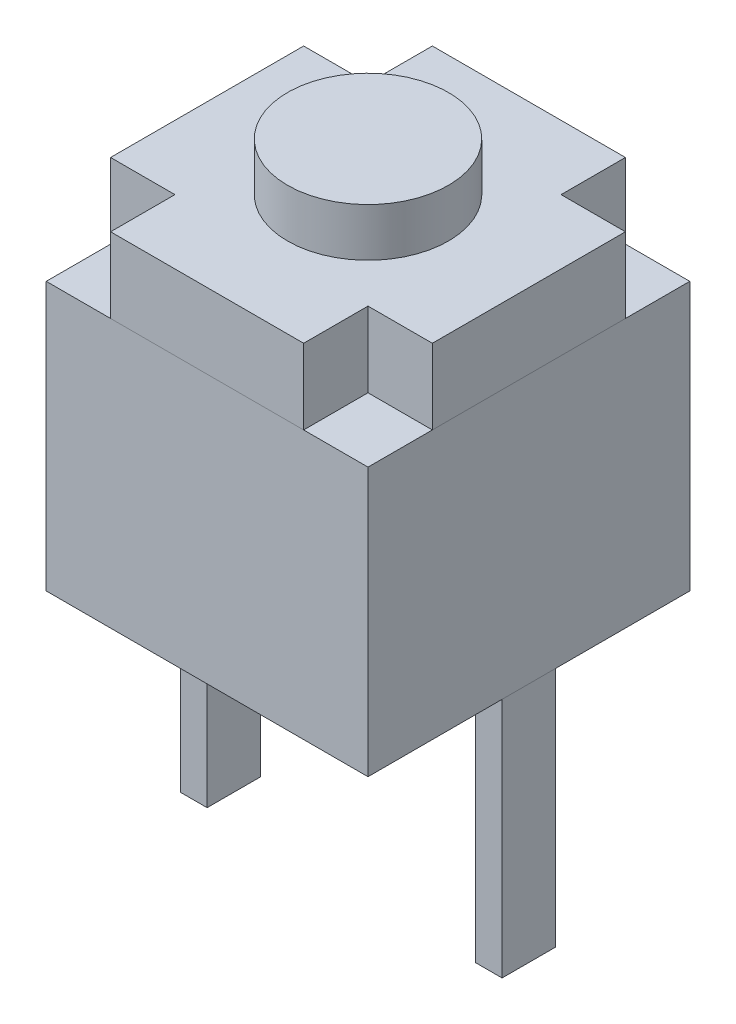
ISO-10303-21;
HEADER;
FILE_DESCRIPTION(('STEP AP214'),'2;1');
FILE_NAME('part.step','',(''),(''),'','','');
FILE_SCHEMA(('AUTOMOTIVE_DESIGN { 1 0 10303 214 1 1 1 1 }'));
ENDSEC;
DATA;
#1=APPLICATION_CONTEXT('core data for automotive mechanical design processes');
#2=APPLICATION_PROTOCOL_DEFINITION('international standard','automotive_design',2000,#1);
#3=PRODUCT_CONTEXT('',#1,'mechanical');
#4=PRODUCT('Part','Part','',(#3));
#5=PRODUCT_RELATED_PRODUCT_CATEGORY('part','',(#4));
#6=PRODUCT_DEFINITION_FORMATION('','',#4);
#7=PRODUCT_DEFINITION_CONTEXT('part definition',#1,'design');
#8=PRODUCT_DEFINITION('design','',#6,#7);
#9=PRODUCT_DEFINITION_SHAPE('','',#8);
#10=(LENGTH_UNIT() NAMED_UNIT(*) SI_UNIT(.MILLI.,.METRE.));
#11=(NAMED_UNIT(*) PLANE_ANGLE_UNIT() SI_UNIT($,.RADIAN.));
#12=(NAMED_UNIT(*) SI_UNIT($,.STERADIAN.) SOLID_ANGLE_UNIT());
#13=UNCERTAINTY_MEASURE_WITH_UNIT(LENGTH_MEASURE(1.E-05),#10,'distance_accuracy_value','');
#14=(GEOMETRIC_REPRESENTATION_CONTEXT(3) GLOBAL_UNCERTAINTY_ASSIGNED_CONTEXT((#13)) GLOBAL_UNIT_ASSIGNED_CONTEXT((#10,
#11,#12)) REPRESENTATION_CONTEXT('',''));
#15=CARTESIAN_POINT('',(0.,0.,0.));
#16=DIRECTION('',(0.,0.,1.));
#17=DIRECTION('',(1.,0.,0.));
#18=AXIS2_PLACEMENT_3D('',#15,#16,#17);
#19=CARTESIAN_POINT('',(-2.5,-4.5,-0.5));
#20=DIRECTION('',(0.,0.,1.));
#21=DIRECTION('',(1.,0.,0.));
#22=AXIS2_PLACEMENT_3D('',#19,#20,#21);
#23=PLANE('',#22);
#24=DIRECTION('',(1.,0.,0.));
#25=VECTOR('',#24,1.);
#26=CARTESIAN_POINT('',(-2.5,0.,-0.5));
#27=LINE('',#26,#25);
#28=CARTESIAN_POINT('',(-3.,0.,-0.5));
#29=VERTEX_POINT('',#28);
#30=CARTESIAN_POINT('',(-2.5,0.,-0.5));
#31=VERTEX_POINT('',#30);
#32=EDGE_CURVE('E109',#29,#31,#27,.T.);
#33=ORIENTED_EDGE('',*,*,#32,.T.);
#34=DIRECTION('',(0.,1.,0.));
#35=VECTOR('',#34,1.);
#36=CARTESIAN_POINT('',(-2.5,-4.5,-0.5));
#37=LINE('',#36,#35);
#38=CARTESIAN_POINT('',(-2.5,-4.5,-0.5));
#39=VERTEX_POINT('',#38);
#40=EDGE_CURVE('E12',#39,#31,#37,.T.);
#41=ORIENTED_EDGE('',*,*,#40,.F.);
#42=DIRECTION('',(1.,0.,0.));
#43=VECTOR('',#42,1.);
#44=CARTESIAN_POINT('',(-2.5,-4.5,-0.5));
#45=LINE('',#44,#43);
#46=CARTESIAN_POINT('',(-3.,-4.5,-0.5));
#47=VERTEX_POINT('',#46);
#48=EDGE_CURVE('E97',#47,#39,#45,.T.);
#49=ORIENTED_EDGE('',*,*,#48,.F.);
#50=DIRECTION('',(0.,1.,0.));
#51=VECTOR('',#50,1.);
#52=CARTESIAN_POINT('',(-3.,-4.5,-0.5));
#53=LINE('',#52,#51);
#54=EDGE_CURVE('E105',#47,#29,#53,.T.);
#55=ORIENTED_EDGE('',*,*,#54,.T.);
#56=EDGE_LOOP('',(#33,#41,#49,#55));
#57=FACE_BOUND('',#56,.T.);
#58=ADVANCED_FACE('F46',(#57),#23,.F.);
#59=CARTESIAN_POINT('',(-2.5,-4.5,-0.5));
#60=DIRECTION('',(-1.,0.,0.));
#61=DIRECTION('',(0.,0.,1.));
#62=AXIS2_PLACEMENT_3D('',#59,#60,#61);
#63=PLANE('',#62);
#64=DIRECTION('',(0.,0.,1.));
#65=VECTOR('',#64,1.);
#66=CARTESIAN_POINT('',(-2.5,0.,-0.5));
#67=LINE('',#66,#65);
#68=CARTESIAN_POINT('',(-2.5,0.,0.5));
#69=VERTEX_POINT('',#68);
#70=EDGE_CURVE('E101',#31,#69,#67,.T.);
#71=ORIENTED_EDGE('',*,*,#70,.T.);
#72=DIRECTION('',(0.,1.,0.));
#73=VECTOR('',#72,1.);
#74=CARTESIAN_POINT('',(-2.5,-4.5,0.5));
#75=LINE('',#74,#73);
#76=CARTESIAN_POINT('',(-2.5,-4.5,0.5));
#77=VERTEX_POINT('',#76);
#78=EDGE_CURVE('E54',#77,#69,#75,.T.);
#79=ORIENTED_EDGE('',*,*,#78,.F.);
#80=DIRECTION('',(0.,0.,1.));
#81=VECTOR('',#80,1.);
#82=CARTESIAN_POINT('',(-2.5,-4.5,-0.5));
#83=LINE('',#82,#81);
#84=EDGE_CURVE('E92',#39,#77,#83,.T.);
#85=ORIENTED_EDGE('',*,*,#84,.F.);
#86=ORIENTED_EDGE('',*,*,#40,.T.);
#87=EDGE_LOOP('',(#71,#79,#85,#86));
#88=FACE_BOUND('',#87,.T.);
#89=ADVANCED_FACE('F100',(#88),#63,.F.);
#90=CARTESIAN_POINT('',(-2.5,-4.5,0.5));
#91=DIRECTION('',(0.,0.,-1.));
#92=DIRECTION('',(-1.,0.,0.));
#93=AXIS2_PLACEMENT_3D('',#90,#91,#92);
#94=PLANE('',#93);
#95=DIRECTION('',(-1.,0.,0.));
#96=VECTOR('',#95,1.);
#97=CARTESIAN_POINT('',(-2.5,0.,0.5));
#98=LINE('',#97,#96);
#99=CARTESIAN_POINT('',(-3.,0.,0.5));
#100=VERTEX_POINT('',#99);
#101=EDGE_CURVE('E79',#69,#100,#98,.T.);
#102=ORIENTED_EDGE('',*,*,#101,.T.);
#103=DIRECTION('',(0.,1.,0.));
#104=VECTOR('',#103,1.);
#105=CARTESIAN_POINT('',(-3.,-4.5,0.5));
#106=LINE('',#105,#104);
#107=CARTESIAN_POINT('',(-3.,-4.5,0.5));
#108=VERTEX_POINT('',#107);
#109=EDGE_CURVE('E102',#108,#100,#106,.T.);
#110=ORIENTED_EDGE('',*,*,#109,.F.);
#111=DIRECTION('',(-1.,0.,0.));
#112=VECTOR('',#111,1.);
#113=CARTESIAN_POINT('',(-2.5,-4.5,0.5));
#114=LINE('',#113,#112);
#115=EDGE_CURVE('E95',#77,#108,#114,.T.);
#116=ORIENTED_EDGE('',*,*,#115,.F.);
#117=ORIENTED_EDGE('',*,*,#78,.T.);
#118=EDGE_LOOP('',(#102,#110,#116,#117));
#119=FACE_BOUND('',#118,.T.);
#120=ADVANCED_FACE('F103',(#119),#94,.F.);
#121=CARTESIAN_POINT('',(-3.,-4.5,-0.5));
#122=DIRECTION('',(1.,0.,0.));
#123=DIRECTION('',(0.,0.,-1.));
#124=AXIS2_PLACEMENT_3D('',#121,#122,#123);
#125=PLANE('',#124);
#126=DIRECTION('',(0.,0.,-1.));
#127=VECTOR('',#126,1.);
#128=CARTESIAN_POINT('',(-3.,0.,-0.5));
#129=LINE('',#128,#127);
#130=EDGE_CURVE('E85',#100,#29,#129,.T.);
#131=ORIENTED_EDGE('',*,*,#130,.T.);
#132=ORIENTED_EDGE('',*,*,#54,.F.);
#133=DIRECTION('',(0.,0.,-1.));
#134=VECTOR('',#133,1.);
#135=CARTESIAN_POINT('',(-3.,-4.5,-0.5));
#136=LINE('',#135,#134);
#137=EDGE_CURVE('E62',#108,#47,#136,.T.);
#138=ORIENTED_EDGE('',*,*,#137,.F.);
#139=ORIENTED_EDGE('',*,*,#109,.T.);
#140=EDGE_LOOP('',(#131,#132,#138,#139));
#141=FACE_BOUND('',#140,.T.);
#142=ADVANCED_FACE('F116',(#141),#125,.F.);
#143=CARTESIAN_POINT('',(0.,-4.5,0.));
#144=DIRECTION('',(0.,1.,0.));
#145=DIRECTION('',(0.,0.,1.));
#146=AXIS2_PLACEMENT_3D('',#143,#144,#145);
#147=PLANE('',#146);
#148=ORIENTED_EDGE('',*,*,#48,.T.);
#149=ORIENTED_EDGE('',*,*,#84,.T.);
#150=ORIENTED_EDGE('',*,*,#115,.T.);
#151=ORIENTED_EDGE('',*,*,#137,.T.);
#152=EDGE_LOOP('',(#148,#149,#150,#151));
#153=FACE_BOUND('',#152,.T.);
#154=ADVANCED_FACE('F93',(#153),#147,.F.);
#155=CARTESIAN_POINT('',(0.,0.,0.));
#156=DIRECTION('',(0.,1.,0.));
#157=DIRECTION('',(0.,0.,1.));
#158=AXIS2_PLACEMENT_3D('',#155,#156,#157);
#159=PLANE('',#158);
#160=ORIENTED_EDGE('',*,*,#32,.F.);
#161=ORIENTED_EDGE('',*,*,#130,.F.);
#162=ORIENTED_EDGE('',*,*,#101,.F.);
#163=ORIENTED_EDGE('',*,*,#70,.F.);
#164=EDGE_LOOP('',(#160,#161,#162,#163));
#165=FACE_BOUND('',#164,.T.);
#166=ADVANCED_FACE('F119',(#165),#159,.T.);
#167=CLOSED_SHELL('',(#58,#89,#120,#142,#154,#166));
#168=MANIFOLD_SOLID_BREP('B2',#167);
#169=CARTESIAN_POINT('',(3.,-4.5,-0.5));
#170=DIRECTION('',(-1.,0.,0.));
#171=DIRECTION('',(0.,0.,1.));
#172=AXIS2_PLACEMENT_3D('',#169,#170,#171);
#173=PLANE('',#172);
#174=DIRECTION('',(0.,0.,1.));
#175=VECTOR('',#174,1.);
#176=CARTESIAN_POINT('',(3.,0.,-0.5));
#177=LINE('',#176,#175);
#178=CARTESIAN_POINT('',(3.,0.,-0.5));
#179=VERTEX_POINT('',#178);
#180=CARTESIAN_POINT('',(3.,0.,0.5));
#181=VERTEX_POINT('',#180);
#182=EDGE_CURVE('E241',#179,#181,#177,.T.);
#183=ORIENTED_EDGE('',*,*,#182,.T.);
#184=DIRECTION('',(0.,1.,0.));
#185=VECTOR('',#184,1.);
#186=CARTESIAN_POINT('',(3.,-4.5,0.5));
#187=LINE('',#186,#185);
#188=CARTESIAN_POINT('',(3.,-4.5,0.5));
#189=VERTEX_POINT('',#188);
#190=EDGE_CURVE('E44',#189,#181,#187,.T.);
#191=ORIENTED_EDGE('',*,*,#190,.F.);
#192=DIRECTION('',(0.,0.,1.));
#193=VECTOR('',#192,1.);
#194=CARTESIAN_POINT('',(3.,-4.5,-0.5));
#195=LINE('',#194,#193);
#196=CARTESIAN_POINT('',(3.,-4.5,-0.5));
#197=VERTEX_POINT('',#196);
#198=EDGE_CURVE('E229',#197,#189,#195,.T.);
#199=ORIENTED_EDGE('',*,*,#198,.F.);
#200=DIRECTION('',(0.,1.,0.));
#201=VECTOR('',#200,1.);
#202=CARTESIAN_POINT('',(3.,-4.5,-0.5));
#203=LINE('',#202,#201);
#204=EDGE_CURVE('E237',#197,#179,#203,.T.);
#205=ORIENTED_EDGE('',*,*,#204,.T.);
#206=EDGE_LOOP('',(#183,#191,#199,#205));
#207=FACE_BOUND('',#206,.T.);
#208=ADVANCED_FACE('F178',(#207),#173,.F.);
#209=CARTESIAN_POINT('',(2.5,-4.5,0.5));
#210=DIRECTION('',(0.,0.,-1.));
#211=DIRECTION('',(-1.,0.,0.));
#212=AXIS2_PLACEMENT_3D('',#209,#210,#211);
#213=PLANE('',#212);
#214=DIRECTION('',(-1.,0.,0.));
#215=VECTOR('',#214,1.);
#216=CARTESIAN_POINT('',(2.5,0.,0.5));
#217=LINE('',#216,#215);
#218=CARTESIAN_POINT('',(2.5,0.,0.5));
#219=VERTEX_POINT('',#218);
#220=EDGE_CURVE('E233',#181,#219,#217,.T.);
#221=ORIENTED_EDGE('',*,*,#220,.T.);
#222=DIRECTION('',(0.,1.,0.));
#223=VECTOR('',#222,1.);
#224=CARTESIAN_POINT('',(2.5,-4.5,0.5));
#225=LINE('',#224,#223);
#226=CARTESIAN_POINT('',(2.5,-4.5,0.5));
#227=VERTEX_POINT('',#226);
#228=EDGE_CURVE('E186',#227,#219,#225,.T.);
#229=ORIENTED_EDGE('',*,*,#228,.F.);
#230=DIRECTION('',(-1.,0.,0.));
#231=VECTOR('',#230,1.);
#232=CARTESIAN_POINT('',(2.5,-4.5,0.5));
#233=LINE('',#232,#231);
#234=EDGE_CURVE('E224',#189,#227,#233,.T.);
#235=ORIENTED_EDGE('',*,*,#234,.F.);
#236=ORIENTED_EDGE('',*,*,#190,.T.);
#237=EDGE_LOOP('',(#221,#229,#235,#236));
#238=FACE_BOUND('',#237,.T.);
#239=ADVANCED_FACE('F232',(#238),#213,.F.);
#240=CARTESIAN_POINT('',(2.5,-4.5,-0.5));
#241=DIRECTION('',(1.,0.,0.));
#242=DIRECTION('',(0.,0.,-1.));
#243=AXIS2_PLACEMENT_3D('',#240,#241,#242);
#244=PLANE('',#243);
#245=DIRECTION('',(0.,0.,-1.));
#246=VECTOR('',#245,1.);
#247=CARTESIAN_POINT('',(2.5,0.,-0.5));
#248=LINE('',#247,#246);
#249=CARTESIAN_POINT('',(2.5,0.,-0.5));
#250=VERTEX_POINT('',#249);
#251=EDGE_CURVE('E211',#219,#250,#248,.T.);
#252=ORIENTED_EDGE('',*,*,#251,.T.);
#253=DIRECTION('',(0.,1.,0.));
#254=VECTOR('',#253,1.);
#255=CARTESIAN_POINT('',(2.5,-4.5,-0.5));
#256=LINE('',#255,#254);
#257=CARTESIAN_POINT('',(2.5,-4.5,-0.5));
#258=VERTEX_POINT('',#257);
#259=EDGE_CURVE('E234',#258,#250,#256,.T.);
#260=ORIENTED_EDGE('',*,*,#259,.F.);
#261=DIRECTION('',(0.,0.,-1.));
#262=VECTOR('',#261,1.);
#263=CARTESIAN_POINT('',(2.5,-4.5,-0.5));
#264=LINE('',#263,#262);
#265=EDGE_CURVE('E227',#227,#258,#264,.T.);
#266=ORIENTED_EDGE('',*,*,#265,.F.);
#267=ORIENTED_EDGE('',*,*,#228,.T.);
#268=EDGE_LOOP('',(#252,#260,#266,#267));
#269=FACE_BOUND('',#268,.T.);
#270=ADVANCED_FACE('F235',(#269),#244,.F.);
#271=CARTESIAN_POINT('',(2.5,-4.5,-0.5));
#272=DIRECTION('',(0.,0.,1.));
#273=DIRECTION('',(1.,0.,0.));
#274=AXIS2_PLACEMENT_3D('',#271,#272,#273);
#275=PLANE('',#274);
#276=DIRECTION('',(1.,0.,0.));
#277=VECTOR('',#276,1.);
#278=CARTESIAN_POINT('',(2.5,0.,-0.5));
#279=LINE('',#278,#277);
#280=EDGE_CURVE('E217',#250,#179,#279,.T.);
#281=ORIENTED_EDGE('',*,*,#280,.T.);
#282=ORIENTED_EDGE('',*,*,#204,.F.);
#283=DIRECTION('',(1.,0.,0.));
#284=VECTOR('',#283,1.);
#285=CARTESIAN_POINT('',(2.5,-4.5,-0.5));
#286=LINE('',#285,#284);
#287=EDGE_CURVE('E194',#258,#197,#286,.T.);
#288=ORIENTED_EDGE('',*,*,#287,.F.);
#289=ORIENTED_EDGE('',*,*,#259,.T.);
#290=EDGE_LOOP('',(#281,#282,#288,#289));
#291=FACE_BOUND('',#290,.T.);
#292=ADVANCED_FACE('F248',(#291),#275,.F.);
#293=CARTESIAN_POINT('',(0.,-4.5,0.));
#294=DIRECTION('',(0.,1.,0.));
#295=DIRECTION('',(0.,0.,1.));
#296=AXIS2_PLACEMENT_3D('',#293,#294,#295);
#297=PLANE('',#296);
#298=ORIENTED_EDGE('',*,*,#198,.T.);
#299=ORIENTED_EDGE('',*,*,#234,.T.);
#300=ORIENTED_EDGE('',*,*,#265,.T.);
#301=ORIENTED_EDGE('',*,*,#287,.T.);
#302=EDGE_LOOP('',(#298,#299,#300,#301));
#303=FACE_BOUND('',#302,.T.);
#304=ADVANCED_FACE('F225',(#303),#297,.F.);
#305=CARTESIAN_POINT('',(0.,0.,0.));
#306=DIRECTION('',(0.,1.,0.));
#307=DIRECTION('',(0.,0.,1.));
#308=AXIS2_PLACEMENT_3D('',#305,#306,#307);
#309=PLANE('',#308);
#310=ORIENTED_EDGE('',*,*,#182,.F.);
#311=ORIENTED_EDGE('',*,*,#280,.F.);
#312=ORIENTED_EDGE('',*,*,#251,.F.);
#313=ORIENTED_EDGE('',*,*,#220,.F.);
#314=EDGE_LOOP('',(#310,#311,#312,#313));
#315=FACE_BOUND('',#314,.T.);
#316=ADVANCED_FACE('F251',(#315),#309,.T.);
#317=CLOSED_SHELL('',(#208,#239,#270,#292,#304,#316));
#318=MANIFOLD_SOLID_BREP('B6',#317);
#319=CARTESIAN_POINT('',(0.,7.3,0.));
#320=DIRECTION('',(0.,-1.,0.));
#321=DIRECTION('',(0.,0.,-1.));
#322=AXIS2_PLACEMENT_3D('',#319,#320,#321);
#323=CYLINDRICAL_SURFACE('',#322,1.5);
#324=CARTESIAN_POINT('',(0.,7.3,0.));
#325=DIRECTION('',(0.,1.,0.));
#326=DIRECTION('',(0.,0.,1.));
#327=AXIS2_PLACEMENT_3D('',#324,#325,#326);
#328=CIRCLE('',#327,1.5);
#329=CARTESIAN_POINT('',(0.,7.3,1.5));
#330=VERTEX_POINT('',#329);
#331=EDGE_CURVE('E177',#330,#330,#328,.T.);
#332=ORIENTED_EDGE('',*,*,#331,.F.);
#333=EDGE_LOOP('',(#332));
#334=FACE_BOUND('',#333,.T.);
#335=CARTESIAN_POINT('',(0.,6.4,0.));
#336=DIRECTION('',(0.,1.,0.));
#337=DIRECTION('',(0.,0.,1.));
#338=AXIS2_PLACEMENT_3D('',#335,#336,#337);
#339=CIRCLE('',#338,1.5);
#340=CARTESIAN_POINT('',(0.,6.4,1.5));
#341=VERTEX_POINT('',#340);
#342=EDGE_CURVE('E315',#341,#341,#339,.T.);
#343=ORIENTED_EDGE('',*,*,#342,.T.);
#344=EDGE_LOOP('',(#343));
#345=FACE_BOUND('',#344,.T.);
#346=ADVANCED_FACE('F312',(#334,#345),#323,.T.);
#347=CARTESIAN_POINT('',(0.,7.3,0.));
#348=DIRECTION('',(0.,1.,0.));
#349=DIRECTION('',(0.,0.,1.));
#350=AXIS2_PLACEMENT_3D('',#347,#348,#349);
#351=PLANE('',#350);
#352=ORIENTED_EDGE('',*,*,#331,.T.);
#353=EDGE_LOOP('',(#352));
#354=FACE_BOUND('',#353,.T.);
#355=ADVANCED_FACE('F327',(#354),#351,.T.);
#356=CARTESIAN_POINT('',(0.,6.4,0.));
#357=DIRECTION('',(0.,1.,0.));
#358=DIRECTION('',(0.,0.,1.));
#359=AXIS2_PLACEMENT_3D('',#356,#357,#358);
#360=PLANE('',#359);
#361=ORIENTED_EDGE('',*,*,#342,.F.);
#362=EDGE_LOOP('',(#361));
#363=FACE_BOUND('',#362,.T.);
#364=ADVANCED_FACE('F325',(#363),#360,.F.);
#365=CLOSED_SHELL('',(#346,#355,#364));
#366=MANIFOLD_SOLID_BREP('B38',#365);
#367=CARTESIAN_POINT('',(-1.8,6.4,0.));
#368=DIRECTION('',(-1.,0.,0.));
#369=DIRECTION('',(0.,0.,1.));
#370=AXIS2_PLACEMENT_3D('',#367,#368,#369);
#371=PLANE('',#370);
#372=DIRECTION('',(0.,0.,-1.));
#373=VECTOR('',#372,1.);
#374=CARTESIAN_POINT('',(-1.8,5.,0.));
#375=LINE('',#374,#373);
#376=CARTESIAN_POINT('',(-1.8,5.,3.));
#377=VERTEX_POINT('',#376);
#378=CARTESIAN_POINT('',(-1.8,5.,1.8));
#379=VERTEX_POINT('',#378);
#380=EDGE_CURVE('E480',#377,#379,#375,.T.);
#381=ORIENTED_EDGE('',*,*,#380,.F.);
#382=DIRECTION('',(0.,-1.,0.));
#383=VECTOR('',#382,1.);
#384=CARTESIAN_POINT('',(-1.8,6.4,3.));
#385=LINE('',#384,#383);
#386=CARTESIAN_POINT('',(-1.8,6.4,3.));
#387=VERTEX_POINT('',#386);
#388=EDGE_CURVE('E310',#387,#377,#385,.T.);
#389=ORIENTED_EDGE('',*,*,#388,.F.);
#390=DIRECTION('',(0.,0.,-1.));
#391=VECTOR('',#390,1.);
#392=CARTESIAN_POINT('',(-1.8,6.4,0.));
#393=LINE('',#392,#391);
#394=CARTESIAN_POINT('',(-1.8,6.4,1.8));
#395=VERTEX_POINT('',#394);
#396=EDGE_CURVE('E508',#387,#395,#393,.T.);
#397=ORIENTED_EDGE('',*,*,#396,.T.);
#398=DIRECTION('',(0.,-1.,0.));
#399=VECTOR('',#398,1.);
#400=CARTESIAN_POINT('',(-1.8,6.4,1.8));
#401=LINE('',#400,#399);
#402=EDGE_CURVE('E424',#395,#379,#401,.T.);
#403=ORIENTED_EDGE('',*,*,#402,.T.);
#404=EDGE_LOOP('',(#381,#389,#397,#403));
#405=FACE_BOUND('',#404,.T.);
#406=ADVANCED_FACE('F362',(#405),#371,.T.);
#407=CARTESIAN_POINT('',(0.,6.4,3.));
#408=DIRECTION('',(0.,0.,-1.));
#409=DIRECTION('',(-1.,0.,0.));
#410=AXIS2_PLACEMENT_3D('',#407,#408,#409);
#411=PLANE('',#410);
#412=DIRECTION('',(1.,0.,0.));
#413=VECTOR('',#412,1.);
#414=CARTESIAN_POINT('',(0.,5.,3.));
#415=LINE('',#414,#413);
#416=CARTESIAN_POINT('',(1.8,5.,3.));
#417=VERTEX_POINT('',#416);
#418=EDGE_CURVE('E483',#377,#417,#415,.T.);
#419=ORIENTED_EDGE('',*,*,#418,.T.);
#420=DIRECTION('',(0.,-1.,0.));
#421=VECTOR('',#420,1.);
#422=CARTESIAN_POINT('',(1.8,6.4,3.));
#423=LINE('',#422,#421);
#424=CARTESIAN_POINT('',(1.8,6.4,3.));
#425=VERTEX_POINT('',#424);
#426=EDGE_CURVE('E370',#425,#417,#423,.T.);
#427=ORIENTED_EDGE('',*,*,#426,.F.);
#428=DIRECTION('',(1.,0.,0.));
#429=VECTOR('',#428,1.);
#430=CARTESIAN_POINT('',(0.,6.4,3.));
#431=LINE('',#430,#429);
#432=EDGE_CURVE('E550',#387,#425,#431,.T.);
#433=ORIENTED_EDGE('',*,*,#432,.F.);
#434=ORIENTED_EDGE('',*,*,#388,.T.);
#435=EDGE_LOOP('',(#419,#427,#433,#434));
#436=FACE_BOUND('',#435,.T.);
#437=ADVANCED_FACE('F570',(#436),#411,.F.);
#438=CARTESIAN_POINT('',(1.8,6.4,0.));
#439=DIRECTION('',(-1.,0.,0.));
#440=DIRECTION('',(0.,0.,1.));
#441=AXIS2_PLACEMENT_3D('',#438,#439,#440);
#442=PLANE('',#441);
#443=DIRECTION('',(0.,0.,-1.));
#444=VECTOR('',#443,1.);
#445=CARTESIAN_POINT('',(1.8,5.,0.));
#446=LINE('',#445,#444);
#447=CARTESIAN_POINT('',(1.8,5.,1.8));
#448=VERTEX_POINT('',#447);
#449=EDGE_CURVE('E485',#417,#448,#446,.T.);
#450=ORIENTED_EDGE('',*,*,#449,.T.);
#451=DIRECTION('',(0.,-1.,0.));
#452=VECTOR('',#451,1.);
#453=CARTESIAN_POINT('',(1.8,6.4,1.8));
#454=LINE('',#453,#452);
#455=CARTESIAN_POINT('',(1.8,6.4,1.8));
#456=VERTEX_POINT('',#455);
#457=EDGE_CURVE('E524',#456,#448,#454,.T.);
#458=ORIENTED_EDGE('',*,*,#457,.F.);
#459=DIRECTION('',(0.,0.,-1.));
#460=VECTOR('',#459,1.);
#461=CARTESIAN_POINT('',(1.8,6.4,0.));
#462=LINE('',#461,#460);
#463=EDGE_CURVE('E532',#425,#456,#462,.T.);
#464=ORIENTED_EDGE('',*,*,#463,.F.);
#465=ORIENTED_EDGE('',*,*,#426,.T.);
#466=EDGE_LOOP('',(#450,#458,#464,#465));
#467=FACE_BOUND('',#466,.T.);
#468=ADVANCED_FACE('F530',(#467),#442,.F.);
#469=CARTESIAN_POINT('',(0.,6.4,1.8));
#470=DIRECTION('',(0.,0.,1.));
#471=DIRECTION('',(1.,0.,0.));
#472=AXIS2_PLACEMENT_3D('',#469,#470,#471);
#473=PLANE('',#472);
#474=DIRECTION('',(-1.,0.,0.));
#475=VECTOR('',#474,1.);
#476=CARTESIAN_POINT('',(0.,5.,1.8));
#477=LINE('',#476,#475);
#478=CARTESIAN_POINT('',(3.,5.,1.8));
#479=VERTEX_POINT('',#478);
#480=EDGE_CURVE('E488',#479,#448,#477,.T.);
#481=ORIENTED_EDGE('',*,*,#480,.F.);
#482=DIRECTION('',(0.,-1.,0.));
#483=VECTOR('',#482,1.);
#484=CARTESIAN_POINT('',(3.,6.4,1.8));
#485=LINE('',#484,#483);
#486=CARTESIAN_POINT('',(3.,6.4,1.8));
#487=VERTEX_POINT('',#486);
#488=EDGE_CURVE('E522',#487,#479,#485,.T.);
#489=ORIENTED_EDGE('',*,*,#488,.F.);
#490=DIRECTION('',(-1.,0.,0.));
#491=VECTOR('',#490,1.);
#492=CARTESIAN_POINT('',(0.,6.4,1.8));
#493=LINE('',#492,#491);
#494=EDGE_CURVE('E545',#487,#456,#493,.T.);
#495=ORIENTED_EDGE('',*,*,#494,.T.);
#496=ORIENTED_EDGE('',*,*,#457,.T.);
#497=EDGE_LOOP('',(#481,#489,#495,#496));
#498=FACE_BOUND('',#497,.T.);
#499=ADVANCED_FACE('F541',(#498),#473,.T.);
#500=CARTESIAN_POINT('',(3.,6.4,0.));
#501=DIRECTION('',(-1.,0.,0.));
#502=DIRECTION('',(0.,0.,1.));
#503=AXIS2_PLACEMENT_3D('',#500,#501,#502);
#504=PLANE('',#503);
#505=DIRECTION('',(0.,0.,-1.));
#506=VECTOR('',#505,1.);
#507=CARTESIAN_POINT('',(3.,5.,0.));
#508=LINE('',#507,#506);
#509=CARTESIAN_POINT('',(3.,5.,-1.8));
#510=VERTEX_POINT('',#509);
#511=EDGE_CURVE('E491',#479,#510,#508,.T.);
#512=ORIENTED_EDGE('',*,*,#511,.T.);
#513=DIRECTION('',(0.,-1.,0.));
#514=VECTOR('',#513,1.);
#515=CARTESIAN_POINT('',(3.,6.4,-1.8));
#516=LINE('',#515,#514);
#517=CARTESIAN_POINT('',(3.,6.4,-1.8));
#518=VERTEX_POINT('',#517);
#519=EDGE_CURVE('E519',#518,#510,#516,.T.);
#520=ORIENTED_EDGE('',*,*,#519,.F.);
#521=DIRECTION('',(0.,0.,-1.));
#522=VECTOR('',#521,1.);
#523=CARTESIAN_POINT('',(3.,6.4,0.));
#524=LINE('',#523,#522);
#525=EDGE_CURVE('E546',#487,#518,#524,.T.);
#526=ORIENTED_EDGE('',*,*,#525,.F.);
#527=ORIENTED_EDGE('',*,*,#488,.T.);
#528=EDGE_LOOP('',(#512,#520,#526,#527));
#529=FACE_BOUND('',#528,.T.);
#530=ADVANCED_FACE('F580',(#529),#504,.F.);
#531=CARTESIAN_POINT('',(0.,6.4,-1.8));
#532=DIRECTION('',(0.,0.,1.));
#533=DIRECTION('',(1.,0.,0.));
#534=AXIS2_PLACEMENT_3D('',#531,#532,#533);
#535=PLANE('',#534);
#536=DIRECTION('',(-1.,0.,0.));
#537=VECTOR('',#536,1.);
#538=CARTESIAN_POINT('',(0.,5.,-1.8));
#539=LINE('',#538,#537);
#540=CARTESIAN_POINT('',(1.8,5.,-1.8));
#541=VERTEX_POINT('',#540);
#542=EDGE_CURVE('E493',#510,#541,#539,.T.);
#543=ORIENTED_EDGE('',*,*,#542,.T.);
#544=DIRECTION('',(0.,-1.,0.));
#545=VECTOR('',#544,1.);
#546=CARTESIAN_POINT('',(1.8,6.4,-1.8));
#547=LINE('',#546,#545);
#548=CARTESIAN_POINT('',(1.8,6.4,-1.8));
#549=VERTEX_POINT('',#548);
#550=EDGE_CURVE('E517',#549,#541,#547,.T.);
#551=ORIENTED_EDGE('',*,*,#550,.F.);
#552=DIRECTION('',(-1.,0.,0.));
#553=VECTOR('',#552,1.);
#554=CARTESIAN_POINT('',(0.,6.4,-1.8));
#555=LINE('',#554,#553);
#556=EDGE_CURVE('E548',#518,#549,#555,.T.);
#557=ORIENTED_EDGE('',*,*,#556,.F.);
#558=ORIENTED_EDGE('',*,*,#519,.T.);
#559=EDGE_LOOP('',(#543,#551,#557,#558));
#560=FACE_BOUND('',#559,.T.);
#561=ADVANCED_FACE('F583',(#560),#535,.F.);
#562=CARTESIAN_POINT('',(1.8,6.4,0.));
#563=DIRECTION('',(1.,0.,0.));
#564=DIRECTION('',(0.,0.,-1.));
#565=AXIS2_PLACEMENT_3D('',#562,#563,#564);
#566=PLANE('',#565);
#567=DIRECTION('',(0.,0.,1.));
#568=VECTOR('',#567,1.);
#569=CARTESIAN_POINT('',(1.8,5.,0.));
#570=LINE('',#569,#568);
#571=CARTESIAN_POINT('',(1.8,5.,-3.));
#572=VERTEX_POINT('',#571);
#573=EDGE_CURVE('E496',#572,#541,#570,.T.);
#574=ORIENTED_EDGE('',*,*,#573,.F.);
#575=DIRECTION('',(0.,-1.,0.));
#576=VECTOR('',#575,1.);
#577=CARTESIAN_POINT('',(1.8,6.4,-3.));
#578=LINE('',#577,#576);
#579=CARTESIAN_POINT('',(1.8,6.4,-3.));
#580=VERTEX_POINT('',#579);
#581=EDGE_CURVE('E515',#580,#572,#578,.T.);
#582=ORIENTED_EDGE('',*,*,#581,.F.);
#583=DIRECTION('',(0.,0.,1.));
#584=VECTOR('',#583,1.);
#585=CARTESIAN_POINT('',(1.8,6.4,0.));
#586=LINE('',#585,#584);
#587=EDGE_CURVE('E555',#580,#549,#586,.T.);
#588=ORIENTED_EDGE('',*,*,#587,.T.);
#589=ORIENTED_EDGE('',*,*,#550,.T.);
#590=EDGE_LOOP('',(#574,#582,#588,#589));
#591=FACE_BOUND('',#590,.T.);
#592=ADVANCED_FACE('F587',(#591),#566,.T.);
#593=CARTESIAN_POINT('',(0.,6.4,-3.));
#594=DIRECTION('',(0.,0.,1.));
#595=DIRECTION('',(1.,0.,0.));
#596=AXIS2_PLACEMENT_3D('',#593,#594,#595);
#597=PLANE('',#596);
#598=DIRECTION('',(-1.,0.,0.));
#599=VECTOR('',#598,1.);
#600=CARTESIAN_POINT('',(0.,5.,-3.));
#601=LINE('',#600,#599);
#602=CARTESIAN_POINT('',(-1.8,5.,-3.));
#603=VERTEX_POINT('',#602);
#604=EDGE_CURVE('E499',#572,#603,#601,.T.);
#605=ORIENTED_EDGE('',*,*,#604,.T.);
#606=DIRECTION('',(0.,-1.,0.));
#607=VECTOR('',#606,1.);
#608=CARTESIAN_POINT('',(-1.8,6.4,-3.));
#609=LINE('',#608,#607);
#610=CARTESIAN_POINT('',(-1.8,6.4,-3.));
#611=VERTEX_POINT('',#610);
#612=EDGE_CURVE('E512',#611,#603,#609,.T.);
#613=ORIENTED_EDGE('',*,*,#612,.F.);
#614=DIRECTION('',(-1.,0.,0.));
#615=VECTOR('',#614,1.);
#616=CARTESIAN_POINT('',(0.,6.4,-3.));
#617=LINE('',#616,#615);
#618=EDGE_CURVE('E475',#580,#611,#617,.T.);
#619=ORIENTED_EDGE('',*,*,#618,.F.);
#620=ORIENTED_EDGE('',*,*,#581,.T.);
#621=EDGE_LOOP('',(#605,#613,#619,#620));
#622=FACE_BOUND('',#621,.T.);
#623=ADVANCED_FACE('F561',(#622),#597,.F.);
#624=CARTESIAN_POINT('',(-1.8,6.4,0.));
#625=DIRECTION('',(1.,0.,0.));
#626=DIRECTION('',(0.,0.,-1.));
#627=AXIS2_PLACEMENT_3D('',#624,#625,#626);
#628=PLANE('',#627);
#629=DIRECTION('',(0.,0.,1.));
#630=VECTOR('',#629,1.);
#631=CARTESIAN_POINT('',(-1.8,5.,0.));
#632=LINE('',#631,#630);
#633=CARTESIAN_POINT('',(-1.8,5.,-1.8));
#634=VERTEX_POINT('',#633);
#635=EDGE_CURVE('E501',#603,#634,#632,.T.);
#636=ORIENTED_EDGE('',*,*,#635,.T.);
#637=DIRECTION('',(0.,-1.,0.));
#638=VECTOR('',#637,1.);
#639=CARTESIAN_POINT('',(-1.8,6.4,-1.8));
#640=LINE('',#639,#638);
#641=CARTESIAN_POINT('',(-1.8,6.4,-1.8));
#642=VERTEX_POINT('',#641);
#643=EDGE_CURVE('E464',#642,#634,#640,.T.);
#644=ORIENTED_EDGE('',*,*,#643,.F.);
#645=DIRECTION('',(0.,0.,1.));
#646=VECTOR('',#645,1.);
#647=CARTESIAN_POINT('',(-1.8,6.4,0.));
#648=LINE('',#647,#646);
#649=EDGE_CURVE('E472',#611,#642,#648,.T.);
#650=ORIENTED_EDGE('',*,*,#649,.F.);
#651=ORIENTED_EDGE('',*,*,#612,.T.);
#652=EDGE_LOOP('',(#636,#644,#650,#651));
#653=FACE_BOUND('',#652,.T.);
#654=ADVANCED_FACE('F565',(#653),#628,.F.);
#655=CARTESIAN_POINT('',(0.,6.4,-1.8));
#656=DIRECTION('',(0.,0.,-1.));
#657=DIRECTION('',(-1.,0.,0.));
#658=AXIS2_PLACEMENT_3D('',#655,#656,#657);
#659=PLANE('',#658);
#660=DIRECTION('',(1.,0.,0.));
#661=VECTOR('',#660,1.);
#662=CARTESIAN_POINT('',(0.,5.,-1.8));
#663=LINE('',#662,#661);
#664=CARTESIAN_POINT('',(-3.,5.,-1.8));
#665=VERTEX_POINT('',#664);
#666=EDGE_CURVE('E463',#665,#634,#663,.T.);
#667=ORIENTED_EDGE('',*,*,#666,.F.);
#668=DIRECTION('',(0.,-1.,0.));
#669=VECTOR('',#668,1.);
#670=CARTESIAN_POINT('',(-3.,6.4,-1.8));
#671=LINE('',#670,#669);
#672=CARTESIAN_POINT('',(-3.,6.4,-1.8));
#673=VERTEX_POINT('',#672);
#674=EDGE_CURVE('E457',#673,#665,#671,.T.);
#675=ORIENTED_EDGE('',*,*,#674,.F.);
#676=DIRECTION('',(1.,0.,0.));
#677=VECTOR('',#676,1.);
#678=CARTESIAN_POINT('',(0.,6.4,-1.8));
#679=LINE('',#678,#677);
#680=EDGE_CURVE('E461',#673,#642,#679,.T.);
#681=ORIENTED_EDGE('',*,*,#680,.T.);
#682=ORIENTED_EDGE('',*,*,#643,.T.);
#683=EDGE_LOOP('',(#667,#675,#681,#682));
#684=FACE_BOUND('',#683,.T.);
#685=ADVANCED_FACE('F459',(#684),#659,.T.);
#686=CARTESIAN_POINT('',(-3.,6.4,0.));
#687=DIRECTION('',(1.,0.,0.));
#688=DIRECTION('',(0.,0.,-1.));
#689=AXIS2_PLACEMENT_3D('',#686,#687,#688);
#690=PLANE('',#689);
#691=DIRECTION('',(0.,0.,1.));
#692=VECTOR('',#691,1.);
#693=CARTESIAN_POINT('',(-3.,5.,0.));
#694=LINE('',#693,#692);
#695=CARTESIAN_POINT('',(-3.,5.,1.8));
#696=VERTEX_POINT('',#695);
#697=EDGE_CURVE('E417',#665,#696,#694,.T.);
#698=ORIENTED_EDGE('',*,*,#697,.T.);
#699=DIRECTION('',(0.,-1.,0.));
#700=VECTOR('',#699,1.);
#701=CARTESIAN_POINT('',(-3.,6.4,1.8));
#702=LINE('',#701,#700);
#703=CARTESIAN_POINT('',(-3.,6.4,1.8));
#704=VERTEX_POINT('',#703);
#705=EDGE_CURVE('E465',#704,#696,#702,.T.);
#706=ORIENTED_EDGE('',*,*,#705,.F.);
#707=DIRECTION('',(0.,0.,1.));
#708=VECTOR('',#707,1.);
#709=CARTESIAN_POINT('',(-3.,6.4,0.));
#710=LINE('',#709,#708);
#711=EDGE_CURVE('E467',#673,#704,#710,.T.);
#712=ORIENTED_EDGE('',*,*,#711,.F.);
#713=ORIENTED_EDGE('',*,*,#674,.T.);
#714=EDGE_LOOP('',(#698,#706,#712,#713));
#715=FACE_BOUND('',#714,.T.);
#716=ADVANCED_FACE('F468',(#715),#690,.F.);
#717=CARTESIAN_POINT('',(0.,6.4,1.8));
#718=DIRECTION('',(0.,0.,-1.));
#719=DIRECTION('',(-1.,0.,0.));
#720=AXIS2_PLACEMENT_3D('',#717,#718,#719);
#721=PLANE('',#720);
#722=DIRECTION('',(1.,0.,0.));
#723=VECTOR('',#722,1.);
#724=CARTESIAN_POINT('',(0.,5.,1.8));
#725=LINE('',#724,#723);
#726=EDGE_CURVE('E506',#696,#379,#725,.T.);
#727=ORIENTED_EDGE('',*,*,#726,.T.);
#728=ORIENTED_EDGE('',*,*,#402,.F.);
#729=DIRECTION('',(1.,0.,0.));
#730=VECTOR('',#729,1.);
#731=CARTESIAN_POINT('',(0.,6.4,1.8));
#732=LINE('',#731,#730);
#733=EDGE_CURVE('E378',#704,#395,#732,.T.);
#734=ORIENTED_EDGE('',*,*,#733,.F.);
#735=ORIENTED_EDGE('',*,*,#705,.T.);
#736=EDGE_LOOP('',(#727,#728,#734,#735));
#737=FACE_BOUND('',#736,.T.);
#738=ADVANCED_FACE('F568',(#737),#721,.F.);
#739=CARTESIAN_POINT('',(0.,6.4,0.));
#740=DIRECTION('',(0.,1.,0.));
#741=DIRECTION('',(0.,0.,1.));
#742=AXIS2_PLACEMENT_3D('',#739,#740,#741);
#743=PLANE('',#742);
#744=ORIENTED_EDGE('',*,*,#396,.F.);
#745=ORIENTED_EDGE('',*,*,#432,.T.);
#746=ORIENTED_EDGE('',*,*,#463,.T.);
#747=ORIENTED_EDGE('',*,*,#494,.F.);
#748=ORIENTED_EDGE('',*,*,#525,.T.);
#749=ORIENTED_EDGE('',*,*,#556,.T.);
#750=ORIENTED_EDGE('',*,*,#587,.F.);
#751=ORIENTED_EDGE('',*,*,#618,.T.);
#752=ORIENTED_EDGE('',*,*,#649,.T.);
#753=ORIENTED_EDGE('',*,*,#680,.F.);
#754=ORIENTED_EDGE('',*,*,#711,.T.);
#755=ORIENTED_EDGE('',*,*,#733,.T.);
#756=EDGE_LOOP('',(#744,#745,#746,#747,#748,#749,#750,#751,#752,#753,#754,#755));
#757=FACE_BOUND('',#756,.T.);
#758=ADVANCED_FACE('F470',(#757),#743,.T.);
#759=CARTESIAN_POINT('',(0.,5.,0.));
#760=DIRECTION('',(0.,1.,0.));
#761=DIRECTION('',(0.,0.,1.));
#762=AXIS2_PLACEMENT_3D('',#759,#760,#761);
#763=PLANE('',#762);
#764=ORIENTED_EDGE('',*,*,#380,.T.);
#765=ORIENTED_EDGE('',*,*,#726,.F.);
#766=ORIENTED_EDGE('',*,*,#697,.F.);
#767=ORIENTED_EDGE('',*,*,#666,.T.);
#768=ORIENTED_EDGE('',*,*,#635,.F.);
#769=ORIENTED_EDGE('',*,*,#604,.F.);
#770=ORIENTED_EDGE('',*,*,#573,.T.);
#771=ORIENTED_EDGE('',*,*,#542,.F.);
#772=ORIENTED_EDGE('',*,*,#511,.F.);
#773=ORIENTED_EDGE('',*,*,#480,.T.);
#774=ORIENTED_EDGE('',*,*,#449,.F.);
#775=ORIENTED_EDGE('',*,*,#418,.F.);
#776=EDGE_LOOP('',(#764,#765,#766,#767,#768,#769,#770,#771,#772,#773,#774,#775));
#777=FACE_BOUND('',#776,.T.);
#778=ADVANCED_FACE('F536',(#777),#763,.F.);
#779=CLOSED_SHELL('',(#406,#437,#468,#499,#530,#561,#592,#623,#654,#685,#716,#738,#758,#778));
#780=MANIFOLD_SOLID_BREP('B172',#779);
#781=CARTESIAN_POINT('',(3.,5.,3.));
#782=DIRECTION('',(-1.,0.,0.));
#783=DIRECTION('',(0.,0.,1.));
#784=AXIS2_PLACEMENT_3D('',#781,#782,#783);
#785=PLANE('',#784);
#786=DIRECTION('',(0.,0.,-1.));
#787=VECTOR('',#786,1.);
#788=CARTESIAN_POINT('',(3.,0.,3.));
#789=LINE('',#788,#787);
#790=CARTESIAN_POINT('',(3.,0.,3.));
#791=VERTEX_POINT('',#790);
#792=CARTESIAN_POINT('',(3.,0.,-3.));
#793=VERTEX_POINT('',#792);
#794=EDGE_CURVE('E769',#791,#793,#789,.T.);
#795=ORIENTED_EDGE('',*,*,#794,.T.);
#796=DIRECTION('',(0.,-1.,0.));
#797=VECTOR('',#796,1.);
#798=CARTESIAN_POINT('',(3.,5.,-3.));
#799=LINE('',#798,#797);
#800=CARTESIAN_POINT('',(3.,5.,-3.));
#801=VERTEX_POINT('',#800);
#802=EDGE_CURVE('E360',#801,#793,#799,.T.);
#803=ORIENTED_EDGE('',*,*,#802,.F.);
#804=DIRECTION('',(0.,0.,-1.));
#805=VECTOR('',#804,1.);
#806=CARTESIAN_POINT('',(3.,5.,3.));
#807=LINE('',#806,#805);
#808=CARTESIAN_POINT('',(3.,5.,3.));
#809=VERTEX_POINT('',#808);
#810=EDGE_CURVE('E757',#809,#801,#807,.T.);
#811=ORIENTED_EDGE('',*,*,#810,.F.);
#812=DIRECTION('',(0.,-1.,0.));
#813=VECTOR('',#812,1.);
#814=CARTESIAN_POINT('',(3.,5.,3.));
#815=LINE('',#814,#813);
#816=EDGE_CURVE('E765',#809,#791,#815,.T.);
#817=ORIENTED_EDGE('',*,*,#816,.T.);
#818=EDGE_LOOP('',(#795,#803,#811,#817));
#819=FACE_BOUND('',#818,.T.);
#820=ADVANCED_FACE('F706',(#819),#785,.F.);
#821=CARTESIAN_POINT('',(-3.,5.,-3.));
#822=DIRECTION('',(0.,0.,1.));
#823=DIRECTION('',(1.,0.,0.));
#824=AXIS2_PLACEMENT_3D('',#821,#822,#823);
#825=PLANE('',#824);
#826=DIRECTION('',(-1.,0.,0.));
#827=VECTOR('',#826,1.);
#828=CARTESIAN_POINT('',(-3.,0.,-3.));
#829=LINE('',#828,#827);
#830=CARTESIAN_POINT('',(-3.,0.,-3.));
#831=VERTEX_POINT('',#830);
#832=EDGE_CURVE('E761',#793,#831,#829,.T.);
#833=ORIENTED_EDGE('',*,*,#832,.T.);
#834=DIRECTION('',(0.,-1.,0.));
#835=VECTOR('',#834,1.);
#836=CARTESIAN_POINT('',(-3.,5.,-3.));
#837=LINE('',#836,#835);
#838=CARTESIAN_POINT('',(-3.,5.,-3.));
#839=VERTEX_POINT('',#838);
#840=EDGE_CURVE('E714',#839,#831,#837,.T.);
#841=ORIENTED_EDGE('',*,*,#840,.F.);
#842=DIRECTION('',(-1.,0.,0.));
#843=VECTOR('',#842,1.);
#844=CARTESIAN_POINT('',(-3.,5.,-3.));
#845=LINE('',#844,#843);
#846=EDGE_CURVE('E752',#801,#839,#845,.T.);
#847=ORIENTED_EDGE('',*,*,#846,.F.);
#848=ORIENTED_EDGE('',*,*,#802,.T.);
#849=EDGE_LOOP('',(#833,#841,#847,#848));
#850=FACE_BOUND('',#849,.T.);
#851=ADVANCED_FACE('F760',(#850),#825,.F.);
#852=CARTESIAN_POINT('',(-3.,5.,3.));
#853=DIRECTION('',(1.,0.,0.));
#854=DIRECTION('',(0.,0.,-1.));
#855=AXIS2_PLACEMENT_3D('',#852,#853,#854);
#856=PLANE('',#855);
#857=DIRECTION('',(0.,0.,1.));
#858=VECTOR('',#857,1.);
#859=CARTESIAN_POINT('',(-3.,0.,3.));
#860=LINE('',#859,#858);
#861=CARTESIAN_POINT('',(-3.,0.,3.));
#862=VERTEX_POINT('',#861);
#863=EDGE_CURVE('E739',#831,#862,#860,.T.);
#864=ORIENTED_EDGE('',*,*,#863,.T.);
#865=DIRECTION('',(0.,-1.,0.));
#866=VECTOR('',#865,1.);
#867=CARTESIAN_POINT('',(-3.,5.,3.));
#868=LINE('',#867,#866);
#869=CARTESIAN_POINT('',(-3.,5.,3.));
#870=VERTEX_POINT('',#869);
#871=EDGE_CURVE('E762',#870,#862,#868,.T.);
#872=ORIENTED_EDGE('',*,*,#871,.F.);
#873=DIRECTION('',(0.,0.,1.));
#874=VECTOR('',#873,1.);
#875=CARTESIAN_POINT('',(-3.,5.,3.));
#876=LINE('',#875,#874);
#877=EDGE_CURVE('E755',#839,#870,#876,.T.);
#878=ORIENTED_EDGE('',*,*,#877,.F.);
#879=ORIENTED_EDGE('',*,*,#840,.T.);
#880=EDGE_LOOP('',(#864,#872,#878,#879));
#881=FACE_BOUND('',#880,.T.);
#882=ADVANCED_FACE('F763',(#881),#856,.F.);
#883=CARTESIAN_POINT('',(-3.,5.,3.));
#884=DIRECTION('',(0.,0.,-1.));
#885=DIRECTION('',(-1.,0.,0.));
#886=AXIS2_PLACEMENT_3D('',#883,#884,#885);
#887=PLANE('',#886);
#888=DIRECTION('',(1.,0.,0.));
#889=VECTOR('',#888,1.);
#890=CARTESIAN_POINT('',(-3.,0.,3.));
#891=LINE('',#890,#889);
#892=EDGE_CURVE('E745',#862,#791,#891,.T.);
#893=ORIENTED_EDGE('',*,*,#892,.T.);
#894=ORIENTED_EDGE('',*,*,#816,.F.);
#895=DIRECTION('',(1.,0.,0.));
#896=VECTOR('',#895,1.);
#897=CARTESIAN_POINT('',(-3.,5.,3.));
#898=LINE('',#897,#896);
#899=EDGE_CURVE('E722',#870,#809,#898,.T.);
#900=ORIENTED_EDGE('',*,*,#899,.F.);
#901=ORIENTED_EDGE('',*,*,#871,.T.);
#902=EDGE_LOOP('',(#893,#894,#900,#901));
#903=FACE_BOUND('',#902,.T.);
#904=ADVANCED_FACE('F776',(#903),#887,.F.);
#905=CARTESIAN_POINT('',(0.,5.,0.));
#906=DIRECTION('',(0.,-1.,0.));
#907=DIRECTION('',(0.,0.,-1.));
#908=AXIS2_PLACEMENT_3D('',#905,#906,#907);
#909=PLANE('',#908);
#910=ORIENTED_EDGE('',*,*,#810,.T.);
#911=ORIENTED_EDGE('',*,*,#846,.T.);
#912=ORIENTED_EDGE('',*,*,#877,.T.);
#913=ORIENTED_EDGE('',*,*,#899,.T.);
#914=EDGE_LOOP('',(#910,#911,#912,#913));
#915=FACE_BOUND('',#914,.T.);
#916=ADVANCED_FACE('F753',(#915),#909,.F.);
#917=CARTESIAN_POINT('',(0.,0.,0.));
#918=DIRECTION('',(0.,-1.,0.));
#919=DIRECTION('',(0.,0.,-1.));
#920=AXIS2_PLACEMENT_3D('',#917,#918,#919);
#921=PLANE('',#920);
#922=ORIENTED_EDGE('',*,*,#794,.F.);
#923=ORIENTED_EDGE('',*,*,#892,.F.);
#924=ORIENTED_EDGE('',*,*,#863,.F.);
#925=ORIENTED_EDGE('',*,*,#832,.F.);
#926=EDGE_LOOP('',(#922,#923,#924,#925));
#927=FACE_BOUND('',#926,.T.);
#928=ADVANCED_FACE('F779',(#927),#921,.T.);
#929=CLOSED_SHELL('',(#820,#851,#882,#904,#916,#928));
#930=MANIFOLD_SOLID_BREP('B304',#929);
#931=ADVANCED_BREP_SHAPE_REPRESENTATION('',(#18,#168,#318,#366,#780,#930),#14);
#932=SHAPE_DEFINITION_REPRESENTATION(#9,#931);
ENDSEC;
END-ISO-10303-21;
